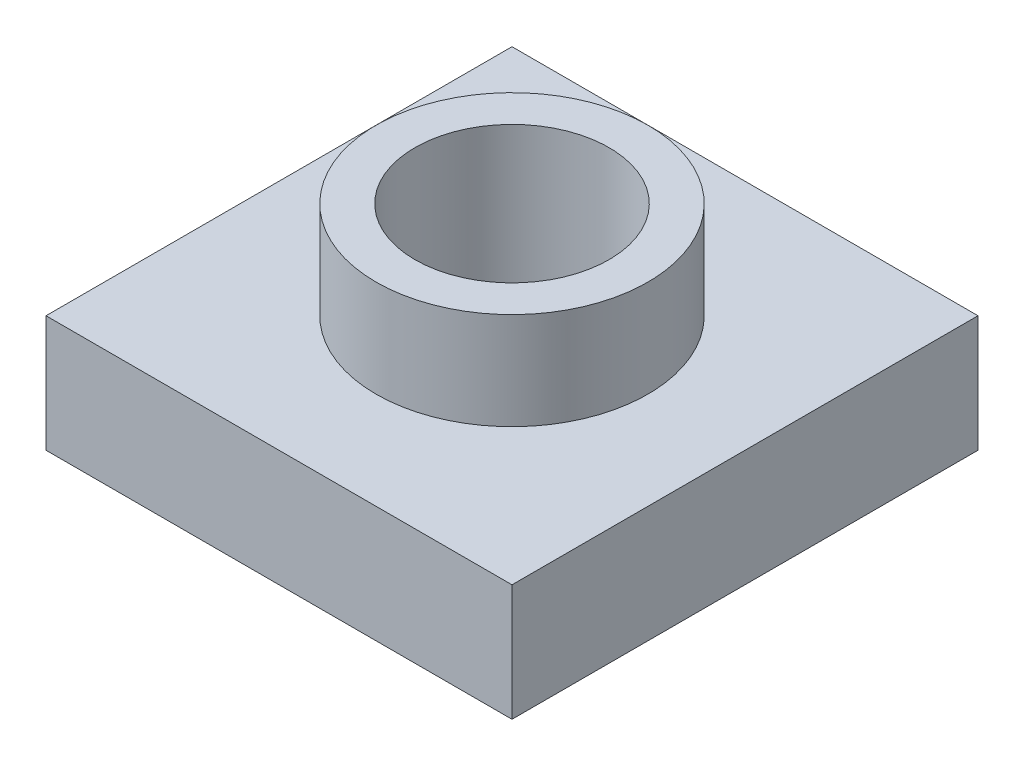
ISO-10303-21;
HEADER;
FILE_DESCRIPTION(('STEP AP214'),'2;1');
FILE_NAME('part.step','',(''),(''),'','','');
FILE_SCHEMA(('AUTOMOTIVE_DESIGN { 1 0 10303 214 1 1 1 1 }'));
ENDSEC;
DATA;
#1=APPLICATION_CONTEXT('core data for automotive mechanical design processes');
#2=APPLICATION_PROTOCOL_DEFINITION('international standard','automotive_design',2000,#1);
#3=PRODUCT_CONTEXT('',#1,'mechanical');
#4=PRODUCT('Part','Part','',(#3));
#5=PRODUCT_RELATED_PRODUCT_CATEGORY('part','',(#4));
#6=PRODUCT_DEFINITION_FORMATION('','',#4);
#7=PRODUCT_DEFINITION_CONTEXT('part definition',#1,'design');
#8=PRODUCT_DEFINITION('design','',#6,#7);
#9=PRODUCT_DEFINITION_SHAPE('','',#8);
#10=(LENGTH_UNIT() NAMED_UNIT(*) SI_UNIT(.MILLI.,.METRE.));
#11=(NAMED_UNIT(*) PLANE_ANGLE_UNIT() SI_UNIT($,.RADIAN.));
#12=(NAMED_UNIT(*) SI_UNIT($,.STERADIAN.) SOLID_ANGLE_UNIT());
#13=UNCERTAINTY_MEASURE_WITH_UNIT(LENGTH_MEASURE(1.E-05),#10,'distance_accuracy_value','');
#14=(GEOMETRIC_REPRESENTATION_CONTEXT(3) GLOBAL_UNCERTAINTY_ASSIGNED_CONTEXT((#13)) GLOBAL_UNIT_ASSIGNED_CONTEXT((#10,
#11,#12)) REPRESENTATION_CONTEXT('',''));
#15=CARTESIAN_POINT('',(0.,0.,0.));
#16=DIRECTION('',(0.,0.,1.));
#17=DIRECTION('',(1.,0.,0.));
#18=AXIS2_PLACEMENT_3D('',#15,#16,#17);
#19=CARTESIAN_POINT('',(-22.8403882689725,30.,-99.3384226546445));
#20=DIRECTION('',(1.,0.,0.));
#21=DIRECTION('',(0.,0.,-1.));
#22=AXIS2_PLACEMENT_3D('',#19,#20,#21);
#23=PLANE('',#22);
#24=DIRECTION('',(0.,0.,1.));
#25=VECTOR('',#24,1.);
#26=CARTESIAN_POINT('',(-22.8403882689725,0.,-99.3384226546445));
#27=LINE('',#26,#25);
#28=CARTESIAN_POINT('',(-22.8403882689725,0.,-99.3384226546445));
#29=VERTEX_POINT('',#28);
#30=CARTESIAN_POINT('',(-22.8403882689724,0.,20.6615773453555));
#31=VERTEX_POINT('',#30);
#32=EDGE_CURVE('E110',#29,#31,#27,.T.);
#33=ORIENTED_EDGE('',*,*,#32,.T.);
#34=DIRECTION('',(0.,-1.,0.));
#35=VECTOR('',#34,1.);
#36=CARTESIAN_POINT('',(-22.8403882689724,30.,20.6615773453555));
#37=LINE('',#36,#35);
#38=CARTESIAN_POINT('',(-22.8403882689724,30.,20.6615773453555));
#39=VERTEX_POINT('',#38);
#40=EDGE_CURVE('E42',#39,#31,#37,.T.);
#41=ORIENTED_EDGE('',*,*,#40,.F.);
#42=DIRECTION('',(0.,0.,1.));
#43=VECTOR('',#42,1.);
#44=CARTESIAN_POINT('',(-22.8403882689725,30.,-99.3384226546445));
#45=LINE('',#44,#43);
#46=CARTESIAN_POINT('',(-22.8403882689725,30.,-99.3384226546445));
#47=VERTEX_POINT('',#46);
#48=EDGE_CURVE('E93',#47,#39,#45,.T.);
#49=ORIENTED_EDGE('',*,*,#48,.F.);
#50=DIRECTION('',(0.,-1.,0.));
#51=VECTOR('',#50,1.);
#52=CARTESIAN_POINT('',(-22.8403882689725,30.,-99.3384226546445));
#53=LINE('',#52,#51);
#54=EDGE_CURVE('E106',#47,#29,#53,.T.);
#55=ORIENTED_EDGE('',*,*,#54,.T.);
#56=EDGE_LOOP('',(#33,#41,#49,#55));
#57=FACE_BOUND('',#56,.T.);
#58=ADVANCED_FACE('F39',(#57),#23,.F.);
#59=CARTESIAN_POINT('',(-22.8403882689724,30.,20.6615773453555));
#60=DIRECTION('',(0.,0.,-1.));
#61=DIRECTION('',(-1.,0.,0.));
#62=AXIS2_PLACEMENT_3D('',#59,#60,#61);
#63=PLANE('',#62);
#64=DIRECTION('',(1.,0.,0.));
#65=VECTOR('',#64,1.);
#66=CARTESIAN_POINT('',(-22.8403882689724,0.,20.6615773453555));
#67=LINE('',#66,#65);
#68=CARTESIAN_POINT('',(97.1596117310276,0.,20.6615773453555));
#69=VERTEX_POINT('',#68);
#70=EDGE_CURVE('E99',#31,#69,#67,.T.);
#71=ORIENTED_EDGE('',*,*,#70,.T.);
#72=DIRECTION('',(0.,-1.,0.));
#73=VECTOR('',#72,1.);
#74=CARTESIAN_POINT('',(97.1596117310276,30.,20.6615773453555));
#75=LINE('',#74,#73);
#76=CARTESIAN_POINT('',(97.1596117310276,30.,20.6615773453555));
#77=VERTEX_POINT('',#76);
#78=EDGE_CURVE('E97',#77,#69,#75,.T.);
#79=ORIENTED_EDGE('',*,*,#78,.F.);
#80=DIRECTION('',(1.,0.,0.));
#81=VECTOR('',#80,1.);
#82=CARTESIAN_POINT('',(-22.8403882689724,30.,20.6615773453555));
#83=LINE('',#82,#81);
#84=EDGE_CURVE('E88',#39,#77,#83,.T.);
#85=ORIENTED_EDGE('',*,*,#84,.F.);
#86=ORIENTED_EDGE('',*,*,#40,.T.);
#87=EDGE_LOOP('',(#71,#79,#85,#86));
#88=FACE_BOUND('',#87,.T.);
#89=ADVANCED_FACE('F98',(#88),#63,.F.);
#90=CARTESIAN_POINT('',(97.1596117310275,30.,-99.3384226546445));
#91=DIRECTION('',(-1.,0.,0.));
#92=DIRECTION('',(0.,0.,1.));
#93=AXIS2_PLACEMENT_3D('',#90,#91,#92);
#94=PLANE('',#93);
#95=DIRECTION('',(0.,0.,-1.));
#96=VECTOR('',#95,1.);
#97=CARTESIAN_POINT('',(97.1596117310275,0.,-99.3384226546445));
#98=LINE('',#97,#96);
#99=CARTESIAN_POINT('',(97.1596117310275,0.,-99.3384226546445));
#100=VERTEX_POINT('',#99);
#101=EDGE_CURVE('E74',#69,#100,#98,.T.);
#102=ORIENTED_EDGE('',*,*,#101,.T.);
#103=DIRECTION('',(0.,-1.,0.));
#104=VECTOR('',#103,1.);
#105=CARTESIAN_POINT('',(97.1596117310275,30.,-99.3384226546445));
#106=LINE('',#105,#104);
#107=CARTESIAN_POINT('',(97.1596117310275,30.,-99.3384226546445));
#108=VERTEX_POINT('',#107);
#109=EDGE_CURVE('E101',#108,#100,#106,.T.);
#110=ORIENTED_EDGE('',*,*,#109,.F.);
#111=DIRECTION('',(0.,0.,-1.));
#112=VECTOR('',#111,1.);
#113=CARTESIAN_POINT('',(97.1596117310275,30.,-99.3384226546445));
#114=LINE('',#113,#112);
#115=EDGE_CURVE('E91',#77,#108,#114,.T.);
#116=ORIENTED_EDGE('',*,*,#115,.F.);
#117=ORIENTED_EDGE('',*,*,#78,.T.);
#118=EDGE_LOOP('',(#102,#110,#116,#117));
#119=FACE_BOUND('',#118,.T.);
#120=ADVANCED_FACE('F102',(#119),#94,.F.);
#121=CARTESIAN_POINT('',(-22.8403882689725,30.,-99.3384226546445));
#122=DIRECTION('',(0.,0.,1.));
#123=DIRECTION('',(1.,0.,0.));
#124=AXIS2_PLACEMENT_3D('',#121,#122,#123);
#125=PLANE('',#124);
#126=DIRECTION('',(-1.,0.,0.));
#127=VECTOR('',#126,1.);
#128=CARTESIAN_POINT('',(-22.8403882689725,0.,-99.3384226546445));
#129=LINE('',#128,#127);
#130=EDGE_CURVE('E80',#100,#29,#129,.T.);
#131=ORIENTED_EDGE('',*,*,#130,.T.);
#132=ORIENTED_EDGE('',*,*,#54,.F.);
#133=DIRECTION('',(-1.,0.,0.));
#134=VECTOR('',#133,1.);
#135=CARTESIAN_POINT('',(-22.8403882689725,30.,-99.3384226546445));
#136=LINE('',#135,#134);
#137=EDGE_CURVE('E57',#108,#47,#136,.T.);
#138=ORIENTED_EDGE('',*,*,#137,.F.);
#139=ORIENTED_EDGE('',*,*,#109,.T.);
#140=EDGE_LOOP('',(#131,#132,#138,#139));
#141=FACE_BOUND('',#140,.T.);
#142=ADVANCED_FACE('F124',(#141),#125,.F.);
#143=CARTESIAN_POINT('',(0.,30.,0.));
#144=DIRECTION('',(0.,1.,0.));
#145=DIRECTION('',(0.,0.,1.));
#146=AXIS2_PLACEMENT_3D('',#143,#144,#145);
#147=PLANE('',#146);
#148=CARTESIAN_POINT('',(37.1596117310276,30.,-39.3384226546445));
#149=DIRECTION('',(0.,1.,0.));
#150=DIRECTION('',(0.,0.,1.));
#151=AXIS2_PLACEMENT_3D('',#148,#149,#150);
#152=CIRCLE('',#151,35.);
#153=CARTESIAN_POINT('',(37.1596117310276,30.,-4.33842265464448));
#154=VERTEX_POINT('',#153);
#155=EDGE_CURVE('E11',#154,#154,#152,.T.);
#156=ORIENTED_EDGE('',*,*,#155,.F.);
#157=EDGE_LOOP('',(#156));
#158=FACE_BOUND('',#157,.T.);
#159=ORIENTED_EDGE('',*,*,#48,.T.);
#160=ORIENTED_EDGE('',*,*,#84,.T.);
#161=ORIENTED_EDGE('',*,*,#115,.T.);
#162=ORIENTED_EDGE('',*,*,#137,.T.);
#163=EDGE_LOOP('',(#159,#160,#161,#162));
#164=FACE_BOUND('',#163,.T.);
#165=ADVANCED_FACE('F89',(#158,#164),#147,.T.);
#166=CARTESIAN_POINT('',(0.,0.,0.));
#167=DIRECTION('',(0.,1.,0.));
#168=DIRECTION('',(0.,0.,1.));
#169=AXIS2_PLACEMENT_3D('',#166,#167,#168);
#170=PLANE('',#169);
#171=CARTESIAN_POINT('',(37.1596117310276,0.,-39.3384226546445));
#172=DIRECTION('',(0.,1.,0.));
#173=DIRECTION('',(0.,0.,1.));
#174=AXIS2_PLACEMENT_3D('',#171,#172,#173);
#175=CIRCLE('',#174,25.);
#176=CARTESIAN_POINT('',(37.1596117310276,0.,-14.3384226546445));
#177=VERTEX_POINT('',#176);
#178=EDGE_CURVE('E134',#177,#177,#175,.T.);
#179=ORIENTED_EDGE('',*,*,#178,.T.);
#180=EDGE_LOOP('',(#179));
#181=FACE_BOUND('',#180,.T.);
#182=ORIENTED_EDGE('',*,*,#32,.F.);
#183=ORIENTED_EDGE('',*,*,#130,.F.);
#184=ORIENTED_EDGE('',*,*,#101,.F.);
#185=ORIENTED_EDGE('',*,*,#70,.F.);
#186=EDGE_LOOP('',(#182,#183,#184,#185));
#187=FACE_BOUND('',#186,.T.);
#188=ADVANCED_FACE('F127',(#181,#187),#170,.F.);
#189=CARTESIAN_POINT('',(37.1596117310276,55.,-39.3384226546445));
#190=DIRECTION('',(0.,-1.,0.));
#191=DIRECTION('',(0.,0.,-1.));
#192=AXIS2_PLACEMENT_3D('',#189,#190,#191);
#193=CYLINDRICAL_SURFACE('',#192,35.);
#194=CARTESIAN_POINT('',(37.1596117310276,55.,-39.3384226546445));
#195=DIRECTION('',(0.,1.,0.));
#196=DIRECTION('',(0.,0.,1.));
#197=AXIS2_PLACEMENT_3D('',#194,#195,#196);
#198=CIRCLE('',#197,35.);
#199=CARTESIAN_POINT('',(37.1596117310276,55.,-4.33842265464448));
#200=VERTEX_POINT('',#199);
#201=EDGE_CURVE('E114',#200,#200,#198,.T.);
#202=ORIENTED_EDGE('',*,*,#201,.F.);
#203=EDGE_LOOP('',(#202));
#204=FACE_BOUND('',#203,.T.);
#205=ORIENTED_EDGE('',*,*,#155,.T.);
#206=EDGE_LOOP('',(#205));
#207=FACE_BOUND('',#206,.T.);
#208=ADVANCED_FACE('F153',(#204,#207),#193,.T.);
#209=CARTESIAN_POINT('',(37.1596117310276,55.,-39.3384226546445));
#210=DIRECTION('',(0.,1.,0.));
#211=DIRECTION('',(0.,0.,1.));
#212=AXIS2_PLACEMENT_3D('',#209,#210,#211);
#213=PLANE('',#212);
#214=CARTESIAN_POINT('',(37.1596117310276,55.,-39.3384226546445));
#215=DIRECTION('',(0.,1.,0.));
#216=DIRECTION('',(0.,0.,1.));
#217=AXIS2_PLACEMENT_3D('',#214,#215,#216);
#218=CIRCLE('',#217,25.);
#219=CARTESIAN_POINT('',(37.1596117310276,55.,-14.3384226546445));
#220=VERTEX_POINT('',#219);
#221=EDGE_CURVE('E135',#220,#220,#218,.T.);
#222=ORIENTED_EDGE('',*,*,#221,.F.);
#223=EDGE_LOOP('',(#222));
#224=FACE_BOUND('',#223,.T.);
#225=ORIENTED_EDGE('',*,*,#201,.T.);
#226=EDGE_LOOP('',(#225));
#227=FACE_BOUND('',#226,.T.);
#228=ADVANCED_FACE('F147',(#224,#227),#213,.T.);
#229=CARTESIAN_POINT('',(37.1596117310276,0.,-39.3384226546445));
#230=DIRECTION('',(0.,1.,0.));
#231=DIRECTION('',(0.,0.,1.));
#232=AXIS2_PLACEMENT_3D('',#229,#230,#231);
#233=CYLINDRICAL_SURFACE('',#232,25.);
#234=ORIENTED_EDGE('',*,*,#178,.F.);
#235=EDGE_LOOP('',(#234));
#236=FACE_BOUND('',#235,.T.);
#237=ORIENTED_EDGE('',*,*,#221,.T.);
#238=EDGE_LOOP('',(#237));
#239=FACE_BOUND('',#238,.T.);
#240=ADVANCED_FACE('F144',(#236,#239),#233,.F.);
#241=CLOSED_SHELL('',(#58,#89,#120,#142,#165,#188,#208,#228,#240));
#242=MANIFOLD_SOLID_BREP('B2',#241);
#243=ADVANCED_BREP_SHAPE_REPRESENTATION('',(#18,#242),#14);
#244=SHAPE_DEFINITION_REPRESENTATION(#9,#243);
ENDSEC;
END-ISO-10303-21;
